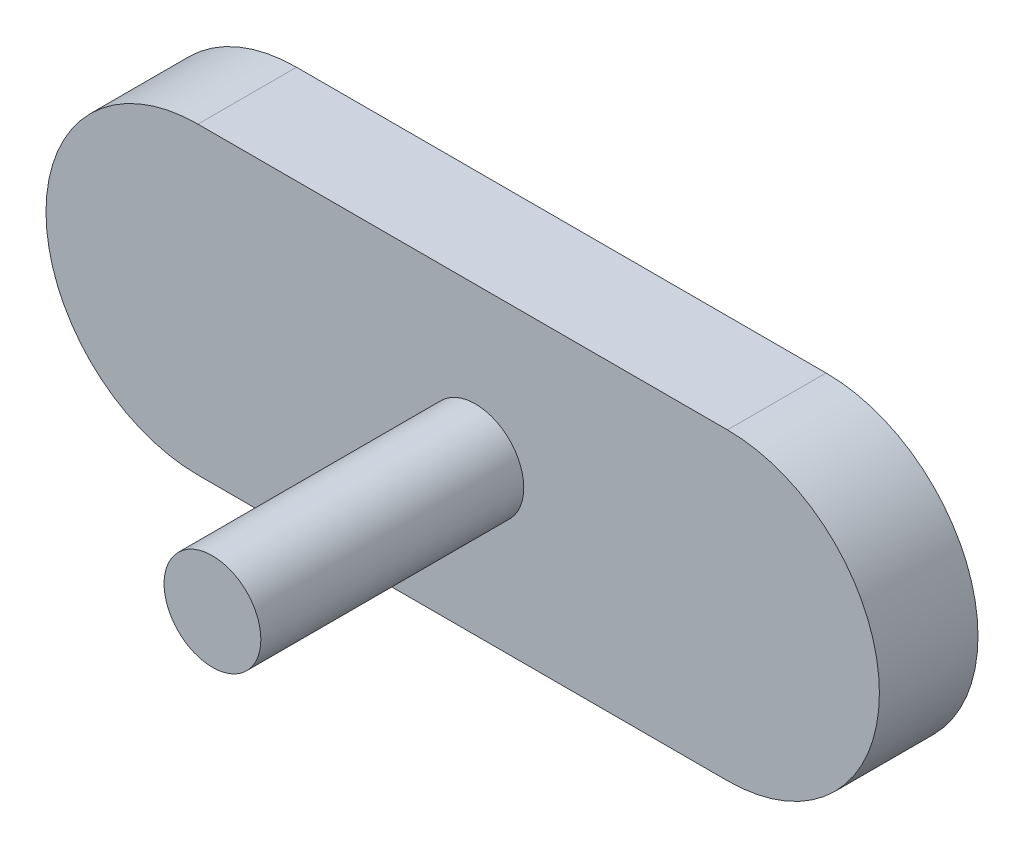
ISO-10303-21;
HEADER;
FILE_DESCRIPTION(('STEP AP214'),'2;1');
FILE_NAME('part.step','',(''),(''),'','','');
FILE_SCHEMA(('AUTOMOTIVE_DESIGN { 1 0 10303 214 1 1 1 1 }'));
ENDSEC;
DATA;
#1=APPLICATION_CONTEXT('core data for automotive mechanical design processes');
#2=APPLICATION_PROTOCOL_DEFINITION('international standard','automotive_design',2000,#1);
#3=PRODUCT_CONTEXT('',#1,'mechanical');
#4=PRODUCT('Part','Part','',(#3));
#5=PRODUCT_RELATED_PRODUCT_CATEGORY('part','',(#4));
#6=PRODUCT_DEFINITION_FORMATION('','',#4);
#7=PRODUCT_DEFINITION_CONTEXT('part definition',#1,'design');
#8=PRODUCT_DEFINITION('design','',#6,#7);
#9=PRODUCT_DEFINITION_SHAPE('','',#8);
#10=(LENGTH_UNIT() NAMED_UNIT(*) SI_UNIT(.MILLI.,.METRE.));
#11=(NAMED_UNIT(*) PLANE_ANGLE_UNIT() SI_UNIT($,.RADIAN.));
#12=(NAMED_UNIT(*) SI_UNIT($,.STERADIAN.) SOLID_ANGLE_UNIT());
#13=UNCERTAINTY_MEASURE_WITH_UNIT(LENGTH_MEASURE(1.E-05),#10,'distance_accuracy_value','');
#14=(GEOMETRIC_REPRESENTATION_CONTEXT(3) GLOBAL_UNCERTAINTY_ASSIGNED_CONTEXT((#13)) GLOBAL_UNIT_ASSIGNED_CONTEXT((#10,
#11,#12)) REPRESENTATION_CONTEXT('',''));
#15=CARTESIAN_POINT('',(0.,0.,0.));
#16=DIRECTION('',(0.,0.,1.));
#17=DIRECTION('',(1.,0.,0.));
#18=AXIS2_PLACEMENT_3D('',#15,#16,#17);
#19=CARTESIAN_POINT('',(-8.44171865446344,0.,3.));
#20=DIRECTION('',(0.,0.,-1.));
#21=DIRECTION('',(-1.,0.,0.));
#22=AXIS2_PLACEMENT_3D('',#19,#20,#21);
#23=CYLINDRICAL_SURFACE('',#22,4.62364066954036);
#24=CARTESIAN_POINT('',(-8.44171865446344,0.,0.));
#25=DIRECTION('',(0.,0.,1.));
#26=DIRECTION('',(1.,0.,0.));
#27=AXIS2_PLACEMENT_3D('',#24,#25,#26);
#28=CIRCLE('',#27,4.62364066954036);
#29=CARTESIAN_POINT('',(-8.44171865446344,4.62364066954036,0.));
#30=VERTEX_POINT('',#29);
#31=CARTESIAN_POINT('',(-8.44171865446344,-4.62364066954036,0.));
#32=VERTEX_POINT('',#31);
#33=EDGE_CURVE('E104',#30,#32,#28,.T.);
#34=ORIENTED_EDGE('',*,*,#33,.T.);
#35=DIRECTION('',(0.,0.,-1.));
#36=VECTOR('',#35,1.);
#37=CARTESIAN_POINT('',(-8.44171865446344,-4.62364066954036,3.));
#38=LINE('',#37,#36);
#39=CARTESIAN_POINT('',(-8.44171865446344,-4.62364066954036,3.));
#40=VERTEX_POINT('',#39);
#41=EDGE_CURVE('E11',#40,#32,#38,.T.);
#42=ORIENTED_EDGE('',*,*,#41,.F.);
#43=CARTESIAN_POINT('',(-8.44171865446344,0.,3.));
#44=DIRECTION('',(0.,0.,1.));
#45=DIRECTION('',(1.,0.,0.));
#46=AXIS2_PLACEMENT_3D('',#43,#44,#45);
#47=CIRCLE('',#46,4.62364066954036);
#48=CARTESIAN_POINT('',(-8.44171865446344,4.62364066954036,3.));
#49=VERTEX_POINT('',#48);
#50=EDGE_CURVE('E92',#49,#40,#47,.T.);
#51=ORIENTED_EDGE('',*,*,#50,.F.);
#52=DIRECTION('',(0.,0.,-1.));
#53=VECTOR('',#52,1.);
#54=CARTESIAN_POINT('',(-8.44171865446344,4.62364066954036,3.));
#55=LINE('',#54,#53);
#56=EDGE_CURVE('E100',#49,#30,#55,.T.);
#57=ORIENTED_EDGE('',*,*,#56,.T.);
#58=EDGE_LOOP('',(#34,#42,#51,#57));
#59=FACE_BOUND('',#58,.T.);
#60=ADVANCED_FACE('F41',(#59),#23,.T.);
#61=CARTESIAN_POINT('',(-8.44171865446344,-4.62364066954036,3.));
#62=DIRECTION('',(0.,1.,0.));
#63=DIRECTION('',(0.,0.,1.));
#64=AXIS2_PLACEMENT_3D('',#61,#62,#63);
#65=PLANE('',#64);
#66=DIRECTION('',(1.,0.,0.));
#67=VECTOR('',#66,1.);
#68=CARTESIAN_POINT('',(-8.44171865446344,-4.62364066954036,0.));
#69=LINE('',#68,#67);
#70=CARTESIAN_POINT('',(7.67080456830743,-4.62364066954036,0.));
#71=VERTEX_POINT('',#70);
#72=EDGE_CURVE('E96',#32,#71,#69,.T.);
#73=ORIENTED_EDGE('',*,*,#72,.T.);
#74=DIRECTION('',(0.,0.,-1.));
#75=VECTOR('',#74,1.);
#76=CARTESIAN_POINT('',(7.67080456830743,-4.62364066954036,3.));
#77=LINE('',#76,#75);
#78=CARTESIAN_POINT('',(7.67080456830743,-4.62364066954036,3.));
#79=VERTEX_POINT('',#78);
#80=EDGE_CURVE('E49',#79,#71,#77,.T.);
#81=ORIENTED_EDGE('',*,*,#80,.F.);
#82=DIRECTION('',(1.,0.,0.));
#83=VECTOR('',#82,1.);
#84=CARTESIAN_POINT('',(-8.44171865446344,-4.62364066954036,3.));
#85=LINE('',#84,#83);
#86=EDGE_CURVE('E87',#40,#79,#85,.T.);
#87=ORIENTED_EDGE('',*,*,#86,.F.);
#88=ORIENTED_EDGE('',*,*,#41,.T.);
#89=EDGE_LOOP('',(#73,#81,#87,#88));
#90=FACE_BOUND('',#89,.T.);
#91=ADVANCED_FACE('F95',(#90),#65,.F.);
#92=CARTESIAN_POINT('',(7.67080456830743,0.,3.));
#93=DIRECTION('',(0.,0.,-1.));
#94=DIRECTION('',(-1.,0.,0.));
#95=AXIS2_PLACEMENT_3D('',#92,#93,#94);
#96=CYLINDRICAL_SURFACE('',#95,4.62364066954036);
#97=CARTESIAN_POINT('',(7.67080456830743,0.,0.));
#98=DIRECTION('',(0.,0.,1.));
#99=DIRECTION('',(1.,0.,0.));
#100=AXIS2_PLACEMENT_3D('',#97,#98,#99);
#101=CIRCLE('',#100,4.62364066954036);
#102=CARTESIAN_POINT('',(7.67080456830743,4.62364066954036,0.));
#103=VERTEX_POINT('',#102);
#104=EDGE_CURVE('E74',#71,#103,#101,.T.);
#105=ORIENTED_EDGE('',*,*,#104,.T.);
#106=DIRECTION('',(0.,0.,-1.));
#107=VECTOR('',#106,1.);
#108=CARTESIAN_POINT('',(7.67080456830743,4.62364066954036,3.));
#109=LINE('',#108,#107);
#110=CARTESIAN_POINT('',(7.67080456830743,4.62364066954036,3.));
#111=VERTEX_POINT('',#110);
#112=EDGE_CURVE('E97',#111,#103,#109,.T.);
#113=ORIENTED_EDGE('',*,*,#112,.F.);
#114=CARTESIAN_POINT('',(7.67080456830743,0.,3.));
#115=DIRECTION('',(0.,0.,1.));
#116=DIRECTION('',(1.,0.,0.));
#117=AXIS2_PLACEMENT_3D('',#114,#115,#116);
#118=CIRCLE('',#117,4.62364066954036);
#119=EDGE_CURVE('E90',#79,#111,#118,.T.);
#120=ORIENTED_EDGE('',*,*,#119,.F.);
#121=ORIENTED_EDGE('',*,*,#80,.T.);
#122=EDGE_LOOP('',(#105,#113,#120,#121));
#123=FACE_BOUND('',#122,.T.);
#124=ADVANCED_FACE('F98',(#123),#96,.T.);
#125=CARTESIAN_POINT('',(-8.44171865446344,4.62364066954036,3.));
#126=DIRECTION('',(0.,-1.,0.));
#127=DIRECTION('',(0.,0.,-1.));
#128=AXIS2_PLACEMENT_3D('',#125,#126,#127);
#129=PLANE('',#128);
#130=DIRECTION('',(-1.,0.,0.));
#131=VECTOR('',#130,1.);
#132=CARTESIAN_POINT('',(-8.44171865446344,4.62364066954036,0.));
#133=LINE('',#132,#131);
#134=EDGE_CURVE('E80',#103,#30,#133,.T.);
#135=ORIENTED_EDGE('',*,*,#134,.T.);
#136=ORIENTED_EDGE('',*,*,#56,.F.);
#137=DIRECTION('',(-1.,0.,0.));
#138=VECTOR('',#137,1.);
#139=CARTESIAN_POINT('',(-8.44171865446344,4.62364066954036,3.));
#140=LINE('',#139,#138);
#141=EDGE_CURVE('E57',#111,#49,#140,.T.);
#142=ORIENTED_EDGE('',*,*,#141,.F.);
#143=ORIENTED_EDGE('',*,*,#112,.T.);
#144=EDGE_LOOP('',(#135,#136,#142,#143));
#145=FACE_BOUND('',#144,.T.);
#146=ADVANCED_FACE('F112',(#145),#129,.F.);
#147=CARTESIAN_POINT('',(-8.44171865446344,0.,3.));
#148=DIRECTION('',(0.,0.,1.));
#149=DIRECTION('',(1.,0.,0.));
#150=AXIS2_PLACEMENT_3D('',#147,#148,#149);
#151=PLANE('',#150);
#152=CARTESIAN_POINT('',(0.,0.,3.));
#153=DIRECTION('',(0.,0.,1.));
#154=DIRECTION('',(1.,0.,0.));
#155=AXIS2_PLACEMENT_3D('',#152,#153,#154);
#156=CIRCLE('',#155,1.47232988831457);
#157=CARTESIAN_POINT('',(1.47232988831457,0.,3.));
#158=VERTEX_POINT('',#157);
#159=EDGE_CURVE('E118',#158,#158,#156,.T.);
#160=ORIENTED_EDGE('',*,*,#159,.F.);
#161=EDGE_LOOP('',(#160));
#162=FACE_BOUND('',#161,.T.);
#163=ORIENTED_EDGE('',*,*,#50,.T.);
#164=ORIENTED_EDGE('',*,*,#86,.T.);
#165=ORIENTED_EDGE('',*,*,#119,.T.);
#166=ORIENTED_EDGE('',*,*,#141,.T.);
#167=EDGE_LOOP('',(#163,#164,#165,#166));
#168=FACE_BOUND('',#167,.T.);
#169=ADVANCED_FACE('F88',(#162,#168),#151,.T.);
#170=CARTESIAN_POINT('',(-8.44171865446344,0.,0.));
#171=DIRECTION('',(0.,0.,1.));
#172=DIRECTION('',(1.,0.,0.));
#173=AXIS2_PLACEMENT_3D('',#170,#171,#172);
#174=PLANE('',#173);
#175=ORIENTED_EDGE('',*,*,#33,.F.);
#176=ORIENTED_EDGE('',*,*,#134,.F.);
#177=ORIENTED_EDGE('',*,*,#104,.F.);
#178=ORIENTED_EDGE('',*,*,#72,.F.);
#179=EDGE_LOOP('',(#175,#176,#177,#178));
#180=FACE_BOUND('',#179,.T.);
#181=ADVANCED_FACE('F115',(#180),#174,.F.);
#182=CARTESIAN_POINT('',(0.,0.,11.));
#183=DIRECTION('',(0.,0.,-1.));
#184=DIRECTION('',(-1.,0.,0.));
#185=AXIS2_PLACEMENT_3D('',#182,#183,#184);
#186=CYLINDRICAL_SURFACE('',#185,1.47232988831457);
#187=CARTESIAN_POINT('',(0.,0.,11.));
#188=DIRECTION('',(0.,0.,1.));
#189=DIRECTION('',(1.,0.,0.));
#190=AXIS2_PLACEMENT_3D('',#187,#188,#189);
#191=CIRCLE('',#190,1.47232988831457);
#192=CARTESIAN_POINT('',(1.47232988831457,0.,11.));
#193=VERTEX_POINT('',#192);
#194=EDGE_CURVE('E107',#193,#193,#191,.T.);
#195=ORIENTED_EDGE('',*,*,#194,.F.);
#196=EDGE_LOOP('',(#195));
#197=FACE_BOUND('',#196,.T.);
#198=ORIENTED_EDGE('',*,*,#159,.T.);
#199=EDGE_LOOP('',(#198));
#200=FACE_BOUND('',#199,.T.);
#201=ADVANCED_FACE('F126',(#197,#200),#186,.T.);
#202=CARTESIAN_POINT('',(0.,0.,11.));
#203=DIRECTION('',(0.,0.,1.));
#204=DIRECTION('',(1.,0.,0.));
#205=AXIS2_PLACEMENT_3D('',#202,#203,#204);
#206=PLANE('',#205);
#207=ORIENTED_EDGE('',*,*,#194,.T.);
#208=EDGE_LOOP('',(#207));
#209=FACE_BOUND('',#208,.T.);
#210=ADVANCED_FACE('F124',(#209),#206,.T.);
#211=CLOSED_SHELL('',(#60,#91,#124,#146,#169,#181,#201,#210));
#212=MANIFOLD_SOLID_BREP('B2',#211);
#213=ADVANCED_BREP_SHAPE_REPRESENTATION('',(#18,#212),#14);
#214=SHAPE_DEFINITION_REPRESENTATION(#9,#213);
ENDSEC;
END-ISO-10303-21;
